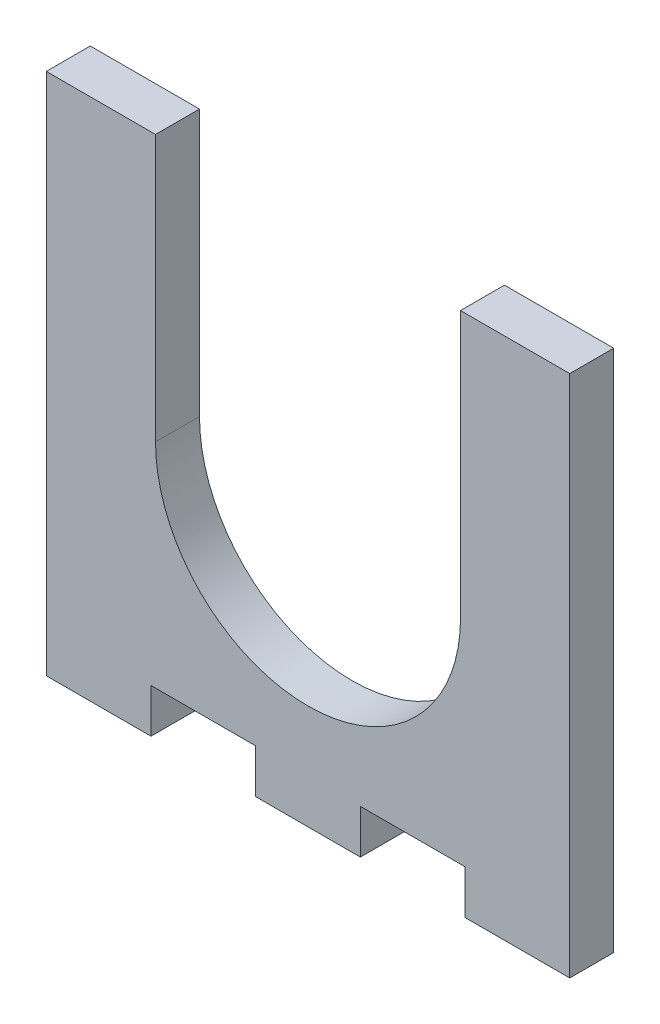
ISO-10303-21;
HEADER;
FILE_DESCRIPTION(('STEP AP214'),'2;1');
FILE_NAME('part.step','',(''),(''),'','','');
FILE_SCHEMA(('AUTOMOTIVE_DESIGN { 1 0 10303 214 1 1 1 1 }'));
ENDSEC;
DATA;
#1=APPLICATION_CONTEXT('core data for automotive mechanical design processes');
#2=APPLICATION_PROTOCOL_DEFINITION('international standard','automotive_design',2000,#1);
#3=PRODUCT_CONTEXT('',#1,'mechanical');
#4=PRODUCT('Part','Part','',(#3));
#5=PRODUCT_RELATED_PRODUCT_CATEGORY('part','',(#4));
#6=PRODUCT_DEFINITION_FORMATION('','',#4);
#7=PRODUCT_DEFINITION_CONTEXT('part definition',#1,'design');
#8=PRODUCT_DEFINITION('design','',#6,#7);
#9=PRODUCT_DEFINITION_SHAPE('','',#8);
#10=(LENGTH_UNIT() NAMED_UNIT(*) SI_UNIT(.MILLI.,.METRE.));
#11=(NAMED_UNIT(*) PLANE_ANGLE_UNIT() SI_UNIT($,.RADIAN.));
#12=(NAMED_UNIT(*) SI_UNIT($,.STERADIAN.) SOLID_ANGLE_UNIT());
#13=UNCERTAINTY_MEASURE_WITH_UNIT(LENGTH_MEASURE(1.E-05),#10,'distance_accuracy_value','');
#14=(GEOMETRIC_REPRESENTATION_CONTEXT(3) GLOBAL_UNCERTAINTY_ASSIGNED_CONTEXT((#13)) GLOBAL_UNIT_ASSIGNED_CONTEXT((#10,
#11,#12)) REPRESENTATION_CONTEXT('',''));
#15=CARTESIAN_POINT('',(0.,0.,0.));
#16=DIRECTION('',(0.,0.,1.));
#17=DIRECTION('',(1.,0.,0.));
#18=AXIS2_PLACEMENT_3D('',#15,#16,#17);
#19=CARTESIAN_POINT('',(0.,63.5,5.334));
#20=DIRECTION('',(0.,-1.,0.));
#21=DIRECTION('',(0.,0.,-1.));
#22=AXIS2_PLACEMENT_3D('',#19,#20,#21);
#23=PLANE('',#22);
#24=DIRECTION('',(-1.,0.,0.));
#25=VECTOR('',#24,1.);
#26=CARTESIAN_POINT('',(0.,63.5,5.334));
#27=LINE('',#26,#25);
#28=CARTESIAN_POINT('',(13.25,63.5,5.334));
#29=VERTEX_POINT('',#28);
#30=CARTESIAN_POINT('',(0.,63.5,5.334));
#31=VERTEX_POINT('',#30);
#32=EDGE_CURVE('E213',#29,#31,#27,.T.);
#33=ORIENTED_EDGE('',*,*,#32,.F.);
#34=DIRECTION('',(0.,0.,1.));
#35=VECTOR('',#34,1.);
#36=CARTESIAN_POINT('',(13.25,63.5,0.));
#37=LINE('',#36,#35);
#38=CARTESIAN_POINT('',(13.25,63.5,0.));
#39=VERTEX_POINT('',#38);
#40=EDGE_CURVE('E168',#39,#29,#37,.T.);
#41=ORIENTED_EDGE('',*,*,#40,.F.);
#42=DIRECTION('',(-1.,0.,0.));
#43=VECTOR('',#42,1.);
#44=CARTESIAN_POINT('',(0.,63.5,0.));
#45=LINE('',#44,#43);
#46=CARTESIAN_POINT('',(0.,63.5,0.));
#47=VERTEX_POINT('',#46);
#48=EDGE_CURVE('E159',#39,#47,#45,.T.);
#49=ORIENTED_EDGE('',*,*,#48,.T.);
#50=DIRECTION('',(0.,0.,-1.));
#51=VECTOR('',#50,1.);
#52=CARTESIAN_POINT('',(0.,63.5,5.334));
#53=LINE('',#52,#51);
#54=EDGE_CURVE('E217',#31,#47,#53,.T.);
#55=ORIENTED_EDGE('',*,*,#54,.F.);
#56=EDGE_LOOP('',(#33,#41,#49,#55));
#57=FACE_BOUND('',#56,.T.);
#58=ADVANCED_FACE('F32',(#57),#23,.F.);
#59=CARTESIAN_POINT('',(0.,0.,5.334));
#60=DIRECTION('',(0.,1.,0.));
#61=DIRECTION('',(0.,0.,1.));
#62=AXIS2_PLACEMENT_3D('',#59,#60,#61);
#63=PLANE('',#62);
#64=DIRECTION('',(1.,0.,0.));
#65=VECTOR('',#64,1.);
#66=CARTESIAN_POINT('',(0.,0.,0.));
#67=LINE('',#66,#65);
#68=CARTESIAN_POINT('',(25.4,0.,0.));
#69=VERTEX_POINT('',#68);
#70=CARTESIAN_POINT('',(38.1,0.,0.));
#71=VERTEX_POINT('',#70);
#72=EDGE_CURVE('E225',#69,#71,#67,.T.);
#73=ORIENTED_EDGE('',*,*,#72,.T.);
#74=DIRECTION('',(0.,0.,1.));
#75=VECTOR('',#74,1.);
#76=CARTESIAN_POINT('',(38.1,0.,0.));
#77=LINE('',#76,#75);
#78=CARTESIAN_POINT('',(38.1,0.,5.334));
#79=VERTEX_POINT('',#78);
#80=EDGE_CURVE('E171',#71,#79,#77,.T.);
#81=ORIENTED_EDGE('',*,*,#80,.T.);
#82=DIRECTION('',(1.,0.,0.));
#83=VECTOR('',#82,1.);
#84=CARTESIAN_POINT('',(0.,0.,5.334));
#85=LINE('',#84,#83);
#86=CARTESIAN_POINT('',(25.4,0.,5.334));
#87=VERTEX_POINT('',#86);
#88=EDGE_CURVE('E211',#87,#79,#85,.T.);
#89=ORIENTED_EDGE('',*,*,#88,.F.);
#90=DIRECTION('',(0.,0.,1.));
#91=VECTOR('',#90,1.);
#92=CARTESIAN_POINT('',(25.4,0.,0.));
#93=LINE('',#92,#91);
#94=EDGE_CURVE('E198',#69,#87,#93,.T.);
#95=ORIENTED_EDGE('',*,*,#94,.F.);
#96=EDGE_LOOP('',(#73,#81,#89,#95));
#97=FACE_BOUND('',#96,.T.);
#98=ADVANCED_FACE('F266',(#97),#63,.F.);
#99=CARTESIAN_POINT('',(0.,0.,0.));
#100=VERTEX_POINT('',#99);
#101=CARTESIAN_POINT('',(12.7,0.,0.));
#102=VERTEX_POINT('',#101);
#103=EDGE_CURVE('E221',#100,#102,#67,.T.);
#104=ORIENTED_EDGE('',*,*,#103,.T.);
#105=DIRECTION('',(0.,0.,1.));
#106=VECTOR('',#105,1.);
#107=CARTESIAN_POINT('',(12.7,0.,0.));
#108=LINE('',#107,#106);
#109=CARTESIAN_POINT('',(12.7,0.,5.334));
#110=VERTEX_POINT('',#109);
#111=EDGE_CURVE('E184',#102,#110,#108,.T.);
#112=ORIENTED_EDGE('',*,*,#111,.T.);
#113=CARTESIAN_POINT('',(0.,0.,5.334));
#114=VERTEX_POINT('',#113);
#115=EDGE_CURVE('E207',#114,#110,#85,.T.);
#116=ORIENTED_EDGE('',*,*,#115,.F.);
#117=DIRECTION('',(0.,0.,-1.));
#118=VECTOR('',#117,1.);
#119=CARTESIAN_POINT('',(0.,0.,5.334));
#120=LINE('',#119,#118);
#121=EDGE_CURVE('E11',#114,#100,#120,.T.);
#122=ORIENTED_EDGE('',*,*,#121,.T.);
#123=EDGE_LOOP('',(#104,#112,#116,#122));
#124=FACE_BOUND('',#123,.T.);
#125=ADVANCED_FACE('F293',(#124),#63,.F.);
#126=CARTESIAN_POINT('',(0.,0.,5.334));
#127=DIRECTION('',(1.,0.,0.));
#128=DIRECTION('',(0.,0.,-1.));
#129=AXIS2_PLACEMENT_3D('',#126,#127,#128);
#130=PLANE('',#129);
#131=DIRECTION('',(0.,-1.,0.));
#132=VECTOR('',#131,1.);
#133=CARTESIAN_POINT('',(0.,0.,0.));
#134=LINE('',#133,#132);
#135=EDGE_CURVE('E195',#47,#100,#134,.T.);
#136=ORIENTED_EDGE('',*,*,#135,.T.);
#137=ORIENTED_EDGE('',*,*,#121,.F.);
#138=DIRECTION('',(0.,-1.,0.));
#139=VECTOR('',#138,1.);
#140=CARTESIAN_POINT('',(0.,0.,5.334));
#141=LINE('',#140,#139);
#142=EDGE_CURVE('E202',#31,#114,#141,.T.);
#143=ORIENTED_EDGE('',*,*,#142,.F.);
#144=ORIENTED_EDGE('',*,*,#54,.T.);
#145=EDGE_LOOP('',(#136,#137,#143,#144));
#146=FACE_BOUND('',#145,.T.);
#147=ADVANCED_FACE('F34',(#146),#130,.F.);
#148=CARTESIAN_POINT('',(50.8,0.,5.334));
#149=VERTEX_POINT('',#148);
#150=CARTESIAN_POINT('',(63.5,0.,5.334));
#151=VERTEX_POINT('',#150);
#152=EDGE_CURVE('E205',#149,#151,#85,.T.);
#153=ORIENTED_EDGE('',*,*,#152,.F.);
#154=DIRECTION('',(0.,0.,1.));
#155=VECTOR('',#154,1.);
#156=CARTESIAN_POINT('',(50.8,0.,0.));
#157=LINE('',#156,#155);
#158=CARTESIAN_POINT('',(50.8,0.,0.));
#159=VERTEX_POINT('',#158);
#160=EDGE_CURVE('E271',#159,#149,#157,.T.);
#161=ORIENTED_EDGE('',*,*,#160,.F.);
#162=CARTESIAN_POINT('',(63.5,0.,0.));
#163=VERTEX_POINT('',#162);
#164=EDGE_CURVE('E220',#159,#163,#67,.T.);
#165=ORIENTED_EDGE('',*,*,#164,.T.);
#166=DIRECTION('',(0.,0.,-1.));
#167=VECTOR('',#166,1.);
#168=CARTESIAN_POINT('',(63.5,0.,5.334));
#169=LINE('',#168,#167);
#170=EDGE_CURVE('E40',#151,#163,#169,.T.);
#171=ORIENTED_EDGE('',*,*,#170,.F.);
#172=EDGE_LOOP('',(#153,#161,#165,#171));
#173=FACE_BOUND('',#172,.T.);
#174=ADVANCED_FACE('F291',(#173),#63,.F.);
#175=CARTESIAN_POINT('',(63.5,0.,5.334));
#176=DIRECTION('',(-1.,0.,0.));
#177=DIRECTION('',(0.,0.,1.));
#178=AXIS2_PLACEMENT_3D('',#175,#176,#177);
#179=PLANE('',#178);
#180=DIRECTION('',(0.,1.,0.));
#181=VECTOR('',#180,1.);
#182=CARTESIAN_POINT('',(63.5,0.,0.));
#183=LINE('',#182,#181);
#184=CARTESIAN_POINT('',(63.5,63.5,0.));
#185=VERTEX_POINT('',#184);
#186=EDGE_CURVE('E224',#163,#185,#183,.T.);
#187=ORIENTED_EDGE('',*,*,#186,.T.);
#188=DIRECTION('',(0.,0.,-1.));
#189=VECTOR('',#188,1.);
#190=CARTESIAN_POINT('',(63.5,63.5,5.334));
#191=LINE('',#190,#189);
#192=CARTESIAN_POINT('',(63.5,63.5,5.334));
#193=VERTEX_POINT('',#192);
#194=EDGE_CURVE('E231',#193,#185,#191,.T.);
#195=ORIENTED_EDGE('',*,*,#194,.F.);
#196=DIRECTION('',(0.,1.,0.));
#197=VECTOR('',#196,1.);
#198=CARTESIAN_POINT('',(63.5,0.,5.334));
#199=LINE('',#198,#197);
#200=EDGE_CURVE('E210',#151,#193,#199,.T.);
#201=ORIENTED_EDGE('',*,*,#200,.F.);
#202=ORIENTED_EDGE('',*,*,#170,.T.);
#203=EDGE_LOOP('',(#187,#195,#201,#202));
#204=FACE_BOUND('',#203,.T.);
#205=ADVANCED_FACE('F238',(#204),#179,.F.);
#206=CARTESIAN_POINT('',(50.25,63.5,0.));
#207=VERTEX_POINT('',#206);
#208=EDGE_CURVE('E206',#185,#207,#45,.T.);
#209=ORIENTED_EDGE('',*,*,#208,.T.);
#210=DIRECTION('',(0.,0.,1.));
#211=VECTOR('',#210,1.);
#212=CARTESIAN_POINT('',(50.25,63.5,0.));
#213=LINE('',#212,#211);
#214=CARTESIAN_POINT('',(50.25,63.5,5.334));
#215=VERTEX_POINT('',#214);
#216=EDGE_CURVE('E249',#207,#215,#213,.T.);
#217=ORIENTED_EDGE('',*,*,#216,.T.);
#218=EDGE_CURVE('E214',#193,#215,#27,.T.);
#219=ORIENTED_EDGE('',*,*,#218,.F.);
#220=ORIENTED_EDGE('',*,*,#194,.T.);
#221=EDGE_LOOP('',(#209,#217,#219,#220));
#222=FACE_BOUND('',#221,.T.);
#223=ADVANCED_FACE('F247',(#222),#23,.F.);
#224=CARTESIAN_POINT('',(0.,0.,5.334));
#225=DIRECTION('',(0.,0.,-1.));
#226=DIRECTION('',(-1.,0.,0.));
#227=AXIS2_PLACEMENT_3D('',#224,#225,#226);
#228=PLANE('',#227);
#229=CARTESIAN_POINT('',(31.75,31.199999957,5.334));
#230=DIRECTION('',(0.,0.,1.));
#231=DIRECTION('',(1.,0.,0.));
#232=AXIS2_PLACEMENT_3D('',#229,#230,#231);
#233=CIRCLE('',#232,18.5);
#234=CARTESIAN_POINT('',(13.25,31.199999957,5.334));
#235=VERTEX_POINT('',#234);
#236=CARTESIAN_POINT('',(50.25,31.199999957,5.334));
#237=VERTEX_POINT('',#236);
#238=EDGE_CURVE('E164',#235,#237,#233,.T.);
#239=ORIENTED_EDGE('',*,*,#238,.F.);
#240=DIRECTION('',(0.,-1.,0.));
#241=VECTOR('',#240,1.);
#242=CARTESIAN_POINT('',(13.25,31.199999957,5.334));
#243=LINE('',#242,#241);
#244=EDGE_CURVE('E47',#29,#235,#243,.T.);
#245=ORIENTED_EDGE('',*,*,#244,.F.);
#246=ORIENTED_EDGE('',*,*,#32,.T.);
#247=ORIENTED_EDGE('',*,*,#142,.T.);
#248=ORIENTED_EDGE('',*,*,#115,.T.);
#249=DIRECTION('',(0.,-1.,0.));
#250=VECTOR('',#249,1.);
#251=CARTESIAN_POINT('',(12.7,0.,5.334));
#252=LINE('',#251,#250);
#253=CARTESIAN_POINT('',(12.7,5.334,5.334));
#254=VERTEX_POINT('',#253);
#255=EDGE_CURVE('E185',#254,#110,#252,.T.);
#256=ORIENTED_EDGE('',*,*,#255,.F.);
#257=DIRECTION('',(-1.,0.,0.));
#258=VECTOR('',#257,1.);
#259=CARTESIAN_POINT('',(12.7,5.334,5.334));
#260=LINE('',#259,#258);
#261=CARTESIAN_POINT('',(25.4,5.334,5.334));
#262=VERTEX_POINT('',#261);
#263=EDGE_CURVE('E178',#262,#254,#260,.T.);
#264=ORIENTED_EDGE('',*,*,#263,.F.);
#265=DIRECTION('',(0.,1.,0.));
#266=VECTOR('',#265,1.);
#267=CARTESIAN_POINT('',(25.4,0.,5.334));
#268=LINE('',#267,#266);
#269=EDGE_CURVE('E187',#87,#262,#268,.T.);
#270=ORIENTED_EDGE('',*,*,#269,.F.);
#271=ORIENTED_EDGE('',*,*,#88,.T.);
#272=DIRECTION('',(0.,-1.,0.));
#273=VECTOR('',#272,1.);
#274=CARTESIAN_POINT('',(38.1,0.,5.334));
#275=LINE('',#274,#273);
#276=CARTESIAN_POINT('',(38.1,5.334,5.334));
#277=VERTEX_POINT('',#276);
#278=EDGE_CURVE('E163',#277,#79,#275,.T.);
#279=ORIENTED_EDGE('',*,*,#278,.F.);
#280=DIRECTION('',(-1.,0.,0.));
#281=VECTOR('',#280,1.);
#282=CARTESIAN_POINT('',(38.1,5.334,5.334));
#283=LINE('',#282,#281);
#284=CARTESIAN_POINT('',(50.8,5.334,5.334));
#285=VERTEX_POINT('',#284);
#286=EDGE_CURVE('E282',#285,#277,#283,.T.);
#287=ORIENTED_EDGE('',*,*,#286,.F.);
#288=DIRECTION('',(0.,1.,0.));
#289=VECTOR('',#288,1.);
#290=CARTESIAN_POINT('',(50.8,0.,5.334));
#291=LINE('',#290,#289);
#292=EDGE_CURVE('E166',#149,#285,#291,.T.);
#293=ORIENTED_EDGE('',*,*,#292,.F.);
#294=ORIENTED_EDGE('',*,*,#152,.T.);
#295=ORIENTED_EDGE('',*,*,#200,.T.);
#296=ORIENTED_EDGE('',*,*,#218,.T.);
#297=DIRECTION('',(0.,1.,0.));
#298=VECTOR('',#297,1.);
#299=CARTESIAN_POINT('',(50.25,31.199999957,5.334));
#300=LINE('',#299,#298);
#301=EDGE_CURVE('E160',#237,#215,#300,.T.);
#302=ORIENTED_EDGE('',*,*,#301,.F.);
#303=EDGE_LOOP('',(#239,#245,#246,#247,#248,#256,#264,#270,#271,#279,#287,#293,#294,#295,#296,#302));
#304=FACE_BOUND('',#303,.T.);
#305=ADVANCED_FACE('F252',(#304),#228,.F.);
#306=CARTESIAN_POINT('',(0.,0.,0.));
#307=DIRECTION('',(0.,0.,-1.));
#308=DIRECTION('',(-1.,0.,0.));
#309=AXIS2_PLACEMENT_3D('',#306,#307,#308);
#310=PLANE('',#309);
#311=DIRECTION('',(0.,-1.,0.));
#312=VECTOR('',#311,1.);
#313=CARTESIAN_POINT('',(13.25,31.199999957,0.));
#314=LINE('',#313,#312);
#315=CARTESIAN_POINT('',(13.25,31.199999957,0.));
#316=VERTEX_POINT('',#315);
#317=EDGE_CURVE('E145',#39,#316,#314,.T.);
#318=ORIENTED_EDGE('',*,*,#317,.T.);
#319=CARTESIAN_POINT('',(31.75,31.199999957,0.));
#320=DIRECTION('',(0.,0.,1.));
#321=DIRECTION('',(1.,0.,0.));
#322=AXIS2_PLACEMENT_3D('',#319,#320,#321);
#323=CIRCLE('',#322,18.5);
#324=CARTESIAN_POINT('',(50.25,31.199999957,0.));
#325=VERTEX_POINT('',#324);
#326=EDGE_CURVE('E157',#316,#325,#323,.T.);
#327=ORIENTED_EDGE('',*,*,#326,.T.);
#328=DIRECTION('',(0.,1.,0.));
#329=VECTOR('',#328,1.);
#330=CARTESIAN_POINT('',(50.25,31.199999957,0.));
#331=LINE('',#330,#329);
#332=EDGE_CURVE('E55',#325,#207,#331,.T.);
#333=ORIENTED_EDGE('',*,*,#332,.T.);
#334=ORIENTED_EDGE('',*,*,#208,.F.);
#335=ORIENTED_EDGE('',*,*,#186,.F.);
#336=ORIENTED_EDGE('',*,*,#164,.F.);
#337=DIRECTION('',(0.,1.,0.));
#338=VECTOR('',#337,1.);
#339=CARTESIAN_POINT('',(50.8,0.,0.));
#340=LINE('',#339,#338);
#341=CARTESIAN_POINT('',(50.8,5.334,0.));
#342=VERTEX_POINT('',#341);
#343=EDGE_CURVE('E275',#159,#342,#340,.T.);
#344=ORIENTED_EDGE('',*,*,#343,.T.);
#345=DIRECTION('',(-1.,0.,0.));
#346=VECTOR('',#345,1.);
#347=CARTESIAN_POINT('',(38.1,5.334,0.));
#348=LINE('',#347,#346);
#349=CARTESIAN_POINT('',(38.1,5.334,0.));
#350=VERTEX_POINT('',#349);
#351=EDGE_CURVE('E272',#342,#350,#348,.T.);
#352=ORIENTED_EDGE('',*,*,#351,.T.);
#353=DIRECTION('',(0.,-1.,0.));
#354=VECTOR('',#353,1.);
#355=CARTESIAN_POINT('',(38.1,0.,0.));
#356=LINE('',#355,#354);
#357=EDGE_CURVE('E277',#350,#71,#356,.T.);
#358=ORIENTED_EDGE('',*,*,#357,.T.);
#359=ORIENTED_EDGE('',*,*,#72,.F.);
#360=DIRECTION('',(0.,1.,0.));
#361=VECTOR('',#360,1.);
#362=CARTESIAN_POINT('',(25.4,0.,0.));
#363=LINE('',#362,#361);
#364=CARTESIAN_POINT('',(25.4,5.334,0.));
#365=VERTEX_POINT('',#364);
#366=EDGE_CURVE('E177',#69,#365,#363,.T.);
#367=ORIENTED_EDGE('',*,*,#366,.T.);
#368=DIRECTION('',(-1.,0.,0.));
#369=VECTOR('',#368,1.);
#370=CARTESIAN_POINT('',(12.7,5.334,0.));
#371=LINE('',#370,#369);
#372=CARTESIAN_POINT('',(12.7,5.334,0.));
#373=VERTEX_POINT('',#372);
#374=EDGE_CURVE('E181',#365,#373,#371,.T.);
#375=ORIENTED_EDGE('',*,*,#374,.T.);
#376=DIRECTION('',(0.,-1.,0.));
#377=VECTOR('',#376,1.);
#378=CARTESIAN_POINT('',(12.7,0.,0.));
#379=LINE('',#378,#377);
#380=EDGE_CURVE('E174',#373,#102,#379,.T.);
#381=ORIENTED_EDGE('',*,*,#380,.T.);
#382=ORIENTED_EDGE('',*,*,#103,.F.);
#383=ORIENTED_EDGE('',*,*,#135,.F.);
#384=ORIENTED_EDGE('',*,*,#48,.F.);
#385=EDGE_LOOP('',(#318,#327,#333,#334,#335,#336,#344,#352,#358,#359,#367,#375,#381,#382,#383,#384));
#386=FACE_BOUND('',#385,.T.);
#387=ADVANCED_FACE('F156',(#386),#310,.T.);
#388=CARTESIAN_POINT('',(12.7,0.,0.));
#389=DIRECTION('',(-1.,0.,0.));
#390=DIRECTION('',(0.,0.,1.));
#391=AXIS2_PLACEMENT_3D('',#388,#389,#390);
#392=PLANE('',#391);
#393=ORIENTED_EDGE('',*,*,#255,.T.);
#394=ORIENTED_EDGE('',*,*,#111,.F.);
#395=ORIENTED_EDGE('',*,*,#380,.F.);
#396=DIRECTION('',(0.,0.,1.));
#397=VECTOR('',#396,1.);
#398=CARTESIAN_POINT('',(12.7,5.334,0.));
#399=LINE('',#398,#397);
#400=EDGE_CURVE('E193',#373,#254,#399,.T.);
#401=ORIENTED_EDGE('',*,*,#400,.T.);
#402=EDGE_LOOP('',(#393,#394,#395,#401));
#403=FACE_BOUND('',#402,.T.);
#404=ADVANCED_FACE('F318',(#403),#392,.F.);
#405=CARTESIAN_POINT('',(12.7,5.334,0.));
#406=DIRECTION('',(0.,1.,0.));
#407=DIRECTION('',(0.,0.,1.));
#408=AXIS2_PLACEMENT_3D('',#405,#406,#407);
#409=PLANE('',#408);
#410=ORIENTED_EDGE('',*,*,#263,.T.);
#411=ORIENTED_EDGE('',*,*,#400,.F.);
#412=ORIENTED_EDGE('',*,*,#374,.F.);
#413=DIRECTION('',(0.,0.,1.));
#414=VECTOR('',#413,1.);
#415=CARTESIAN_POINT('',(25.4,5.334,0.));
#416=LINE('',#415,#414);
#417=EDGE_CURVE('E196',#365,#262,#416,.T.);
#418=ORIENTED_EDGE('',*,*,#417,.T.);
#419=EDGE_LOOP('',(#410,#411,#412,#418));
#420=FACE_BOUND('',#419,.T.);
#421=ADVANCED_FACE('F322',(#420),#409,.F.);
#422=CARTESIAN_POINT('',(25.4,0.,0.));
#423=DIRECTION('',(1.,0.,0.));
#424=DIRECTION('',(0.,0.,-1.));
#425=AXIS2_PLACEMENT_3D('',#422,#423,#424);
#426=PLANE('',#425);
#427=ORIENTED_EDGE('',*,*,#269,.T.);
#428=ORIENTED_EDGE('',*,*,#417,.F.);
#429=ORIENTED_EDGE('',*,*,#366,.F.);
#430=ORIENTED_EDGE('',*,*,#94,.T.);
#431=EDGE_LOOP('',(#427,#428,#429,#430));
#432=FACE_BOUND('',#431,.T.);
#433=ADVANCED_FACE('F324',(#432),#426,.F.);
#434=CARTESIAN_POINT('',(38.1,0.,0.));
#435=DIRECTION('',(-1.,0.,0.));
#436=DIRECTION('',(0.,0.,1.));
#437=AXIS2_PLACEMENT_3D('',#434,#435,#436);
#438=PLANE('',#437);
#439=ORIENTED_EDGE('',*,*,#278,.T.);
#440=ORIENTED_EDGE('',*,*,#80,.F.);
#441=ORIENTED_EDGE('',*,*,#357,.F.);
#442=DIRECTION('',(0.,0.,1.));
#443=VECTOR('',#442,1.);
#444=CARTESIAN_POINT('',(38.1,5.334,0.));
#445=LINE('',#444,#443);
#446=EDGE_CURVE('E188',#350,#277,#445,.T.);
#447=ORIENTED_EDGE('',*,*,#446,.T.);
#448=EDGE_LOOP('',(#439,#440,#441,#447));
#449=FACE_BOUND('',#448,.T.);
#450=ADVANCED_FACE('F327',(#449),#438,.F.);
#451=CARTESIAN_POINT('',(38.1,5.334,0.));
#452=DIRECTION('',(0.,1.,0.));
#453=DIRECTION('',(0.,0.,1.));
#454=AXIS2_PLACEMENT_3D('',#451,#452,#453);
#455=PLANE('',#454);
#456=ORIENTED_EDGE('',*,*,#286,.T.);
#457=ORIENTED_EDGE('',*,*,#446,.F.);
#458=ORIENTED_EDGE('',*,*,#351,.F.);
#459=DIRECTION('',(0.,0.,1.));
#460=VECTOR('',#459,1.);
#461=CARTESIAN_POINT('',(50.8,5.334,0.));
#462=LINE('',#461,#460);
#463=EDGE_CURVE('E273',#342,#285,#462,.T.);
#464=ORIENTED_EDGE('',*,*,#463,.T.);
#465=EDGE_LOOP('',(#456,#457,#458,#464));
#466=FACE_BOUND('',#465,.T.);
#467=ADVANCED_FACE('F288',(#466),#455,.F.);
#468=CARTESIAN_POINT('',(50.8,0.,0.));
#469=DIRECTION('',(1.,0.,0.));
#470=DIRECTION('',(0.,0.,-1.));
#471=AXIS2_PLACEMENT_3D('',#468,#469,#470);
#472=PLANE('',#471);
#473=ORIENTED_EDGE('',*,*,#292,.T.);
#474=ORIENTED_EDGE('',*,*,#463,.F.);
#475=ORIENTED_EDGE('',*,*,#343,.F.);
#476=ORIENTED_EDGE('',*,*,#160,.T.);
#477=EDGE_LOOP('',(#473,#474,#475,#476));
#478=FACE_BOUND('',#477,.T.);
#479=ADVANCED_FACE('F290',(#478),#472,.F.);
#480=CARTESIAN_POINT('',(31.75,31.199999957,0.));
#481=DIRECTION('',(0.,0.,1.));
#482=DIRECTION('',(1.,0.,0.));
#483=AXIS2_PLACEMENT_3D('',#480,#481,#482);
#484=CYLINDRICAL_SURFACE('',#483,18.5);
#485=ORIENTED_EDGE('',*,*,#238,.T.);
#486=DIRECTION('',(0.,0.,1.));
#487=VECTOR('',#486,1.);
#488=CARTESIAN_POINT('',(50.25,31.199999957,0.));
#489=LINE('',#488,#487);
#490=EDGE_CURVE('E151',#325,#237,#489,.T.);
#491=ORIENTED_EDGE('',*,*,#490,.F.);
#492=ORIENTED_EDGE('',*,*,#326,.F.);
#493=DIRECTION('',(0.,0.,1.));
#494=VECTOR('',#493,1.);
#495=CARTESIAN_POINT('',(13.25,31.199999957,0.));
#496=LINE('',#495,#494);
#497=EDGE_CURVE('E142',#316,#235,#496,.T.);
#498=ORIENTED_EDGE('',*,*,#497,.T.);
#499=EDGE_LOOP('',(#485,#491,#492,#498));
#500=FACE_BOUND('',#499,.T.);
#501=ADVANCED_FACE('F162',(#500),#484,.F.);
#502=CARTESIAN_POINT('',(13.25,31.199999957,0.));
#503=DIRECTION('',(-1.,0.,0.));
#504=DIRECTION('',(0.,0.,1.));
#505=AXIS2_PLACEMENT_3D('',#502,#503,#504);
#506=PLANE('',#505);
#507=ORIENTED_EDGE('',*,*,#244,.T.);
#508=ORIENTED_EDGE('',*,*,#497,.F.);
#509=ORIENTED_EDGE('',*,*,#317,.F.);
#510=ORIENTED_EDGE('',*,*,#40,.T.);
#511=EDGE_LOOP('',(#507,#508,#509,#510));
#512=FACE_BOUND('',#511,.T.);
#513=ADVANCED_FACE('F144',(#512),#506,.F.);
#514=CARTESIAN_POINT('',(50.25,31.199999957,0.));
#515=DIRECTION('',(1.,0.,0.));
#516=DIRECTION('',(0.,0.,-1.));
#517=AXIS2_PLACEMENT_3D('',#514,#515,#516);
#518=PLANE('',#517);
#519=ORIENTED_EDGE('',*,*,#301,.T.);
#520=ORIENTED_EDGE('',*,*,#216,.F.);
#521=ORIENTED_EDGE('',*,*,#332,.F.);
#522=ORIENTED_EDGE('',*,*,#490,.T.);
#523=EDGE_LOOP('',(#519,#520,#521,#522));
#524=FACE_BOUND('',#523,.T.);
#525=ADVANCED_FACE('F342',(#524),#518,.F.);
#526=CLOSED_SHELL('',(#58,#98,#125,#147,#174,#205,#223,#305,#387,#404,#421,#433,#450,#467,#479,
#501,#513,#525));
#527=MANIFOLD_SOLID_BREP('B2',#526);
#528=ADVANCED_BREP_SHAPE_REPRESENTATION('',(#18,#527),#14);
#529=SHAPE_DEFINITION_REPRESENTATION(#9,#528);
ENDSEC;
END-ISO-10303-21;
